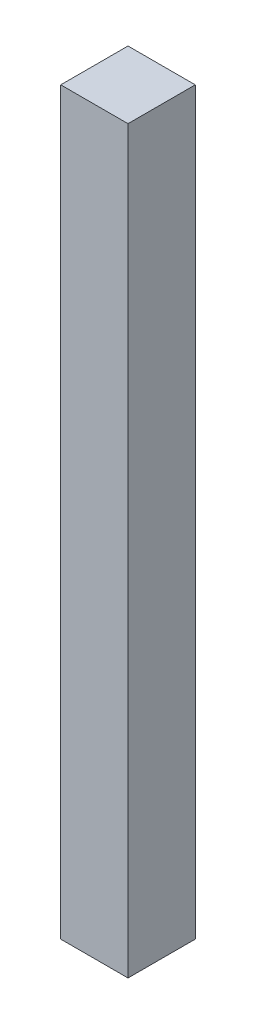
ISO-10303-21;
HEADER;
FILE_DESCRIPTION(('STEP AP214'),'2;1');
FILE_NAME('part.step','',(''),(''),'','','');
FILE_SCHEMA(('AUTOMOTIVE_DESIGN { 1 0 10303 214 1 1 1 1 }'));
ENDSEC;
DATA;
#1=APPLICATION_CONTEXT('core data for automotive mechanical design processes');
#2=APPLICATION_PROTOCOL_DEFINITION('international standard','automotive_design',2000,#1);
#3=PRODUCT_CONTEXT('',#1,'mechanical');
#4=PRODUCT('Part','Part','',(#3));
#5=PRODUCT_RELATED_PRODUCT_CATEGORY('part','',(#4));
#6=PRODUCT_DEFINITION_FORMATION('','',#4);
#7=PRODUCT_DEFINITION_CONTEXT('part definition',#1,'design');
#8=PRODUCT_DEFINITION('design','',#6,#7);
#9=PRODUCT_DEFINITION_SHAPE('','',#8);
#10=(LENGTH_UNIT() NAMED_UNIT(*) SI_UNIT(.MILLI.,.METRE.));
#11=(NAMED_UNIT(*) PLANE_ANGLE_UNIT() SI_UNIT($,.RADIAN.));
#12=(NAMED_UNIT(*) SI_UNIT($,.STERADIAN.) SOLID_ANGLE_UNIT());
#13=UNCERTAINTY_MEASURE_WITH_UNIT(LENGTH_MEASURE(1.E-05),#10,'distance_accuracy_value','');
#14=(GEOMETRIC_REPRESENTATION_CONTEXT(3) GLOBAL_UNCERTAINTY_ASSIGNED_CONTEXT((#13)) GLOBAL_UNIT_ASSIGNED_CONTEXT((#10,
#11,#12)) REPRESENTATION_CONTEXT('',''));
#15=CARTESIAN_POINT('',(0.,0.,0.));
#16=DIRECTION('',(0.,0.,1.));
#17=DIRECTION('',(1.,0.,0.));
#18=AXIS2_PLACEMENT_3D('',#15,#16,#17);
#19=CARTESIAN_POINT('',(10.,220.,-10.));
#20=DIRECTION('',(-1.,0.,0.));
#21=DIRECTION('',(0.,0.,1.));
#22=AXIS2_PLACEMENT_3D('',#19,#20,#21);
#23=PLANE('',#22);
#24=DIRECTION('',(0.,0.,-1.));
#25=VECTOR('',#24,1.);
#26=CARTESIAN_POINT('',(10.,0.,-10.));
#27=LINE('',#26,#25);
#28=CARTESIAN_POINT('',(10.,0.,10.));
#29=VERTEX_POINT('',#28);
#30=CARTESIAN_POINT('',(10.,0.,-10.));
#31=VERTEX_POINT('',#30);
#32=EDGE_CURVE('E97',#29,#31,#27,.T.);
#33=ORIENTED_EDGE('',*,*,#32,.T.);
#34=DIRECTION('',(0.,-1.,0.));
#35=VECTOR('',#34,1.);
#36=CARTESIAN_POINT('',(10.,220.,-10.));
#37=LINE('',#36,#35);
#38=CARTESIAN_POINT('',(10.,220.,-10.));
#39=VERTEX_POINT('',#38);
#40=EDGE_CURVE('E11',#39,#31,#37,.T.);
#41=ORIENTED_EDGE('',*,*,#40,.F.);
#42=DIRECTION('',(0.,0.,-1.));
#43=VECTOR('',#42,1.);
#44=CARTESIAN_POINT('',(10.,220.,-10.));
#45=LINE('',#44,#43);
#46=CARTESIAN_POINT('',(10.,220.,10.));
#47=VERTEX_POINT('',#46);
#48=EDGE_CURVE('E85',#47,#39,#45,.T.);
#49=ORIENTED_EDGE('',*,*,#48,.F.);
#50=DIRECTION('',(0.,-1.,0.));
#51=VECTOR('',#50,1.);
#52=CARTESIAN_POINT('',(10.,220.,10.));
#53=LINE('',#52,#51);
#54=EDGE_CURVE('E93',#47,#29,#53,.T.);
#55=ORIENTED_EDGE('',*,*,#54,.T.);
#56=EDGE_LOOP('',(#33,#41,#49,#55));
#57=FACE_BOUND('',#56,.T.);
#58=ADVANCED_FACE('F34',(#57),#23,.F.);
#59=CARTESIAN_POINT('',(-10.,220.,-10.));
#60=DIRECTION('',(0.,0.,1.));
#61=DIRECTION('',(1.,0.,0.));
#62=AXIS2_PLACEMENT_3D('',#59,#60,#61);
#63=PLANE('',#62);
#64=DIRECTION('',(-1.,0.,0.));
#65=VECTOR('',#64,1.);
#66=CARTESIAN_POINT('',(-10.,0.,-10.));
#67=LINE('',#66,#65);
#68=CARTESIAN_POINT('',(-10.,0.,-10.));
#69=VERTEX_POINT('',#68);
#70=EDGE_CURVE('E89',#31,#69,#67,.T.);
#71=ORIENTED_EDGE('',*,*,#70,.T.);
#72=DIRECTION('',(0.,-1.,0.));
#73=VECTOR('',#72,1.);
#74=CARTESIAN_POINT('',(-10.,220.,-10.));
#75=LINE('',#74,#73);
#76=CARTESIAN_POINT('',(-10.,220.,-10.));
#77=VERTEX_POINT('',#76);
#78=EDGE_CURVE('E42',#77,#69,#75,.T.);
#79=ORIENTED_EDGE('',*,*,#78,.F.);
#80=DIRECTION('',(-1.,0.,0.));
#81=VECTOR('',#80,1.);
#82=CARTESIAN_POINT('',(-10.,220.,-10.));
#83=LINE('',#82,#81);
#84=EDGE_CURVE('E80',#39,#77,#83,.T.);
#85=ORIENTED_EDGE('',*,*,#84,.F.);
#86=ORIENTED_EDGE('',*,*,#40,.T.);
#87=EDGE_LOOP('',(#71,#79,#85,#86));
#88=FACE_BOUND('',#87,.T.);
#89=ADVANCED_FACE('F88',(#88),#63,.F.);
#90=CARTESIAN_POINT('',(-10.,220.,-10.));
#91=DIRECTION('',(1.,0.,0.));
#92=DIRECTION('',(0.,0.,-1.));
#93=AXIS2_PLACEMENT_3D('',#90,#91,#92);
#94=PLANE('',#93);
#95=DIRECTION('',(0.,0.,1.));
#96=VECTOR('',#95,1.);
#97=CARTESIAN_POINT('',(-10.,0.,-10.));
#98=LINE('',#97,#96);
#99=CARTESIAN_POINT('',(-10.,0.,10.));
#100=VERTEX_POINT('',#99);
#101=EDGE_CURVE('E67',#69,#100,#98,.T.);
#102=ORIENTED_EDGE('',*,*,#101,.T.);
#103=DIRECTION('',(0.,-1.,0.));
#104=VECTOR('',#103,1.);
#105=CARTESIAN_POINT('',(-10.,220.,10.));
#106=LINE('',#105,#104);
#107=CARTESIAN_POINT('',(-10.,220.,10.));
#108=VERTEX_POINT('',#107);
#109=EDGE_CURVE('E90',#108,#100,#106,.T.);
#110=ORIENTED_EDGE('',*,*,#109,.F.);
#111=DIRECTION('',(0.,0.,1.));
#112=VECTOR('',#111,1.);
#113=CARTESIAN_POINT('',(-10.,220.,-10.));
#114=LINE('',#113,#112);
#115=EDGE_CURVE('E83',#77,#108,#114,.T.);
#116=ORIENTED_EDGE('',*,*,#115,.F.);
#117=ORIENTED_EDGE('',*,*,#78,.T.);
#118=EDGE_LOOP('',(#102,#110,#116,#117));
#119=FACE_BOUND('',#118,.T.);
#120=ADVANCED_FACE('F91',(#119),#94,.F.);
#121=CARTESIAN_POINT('',(-10.,220.,10.));
#122=DIRECTION('',(0.,0.,-1.));
#123=DIRECTION('',(-1.,0.,0.));
#124=AXIS2_PLACEMENT_3D('',#121,#122,#123);
#125=PLANE('',#124);
#126=DIRECTION('',(1.,0.,0.));
#127=VECTOR('',#126,1.);
#128=CARTESIAN_POINT('',(-10.,0.,10.));
#129=LINE('',#128,#127);
#130=EDGE_CURVE('E73',#100,#29,#129,.T.);
#131=ORIENTED_EDGE('',*,*,#130,.T.);
#132=ORIENTED_EDGE('',*,*,#54,.F.);
#133=DIRECTION('',(1.,0.,0.));
#134=VECTOR('',#133,1.);
#135=CARTESIAN_POINT('',(-10.,220.,10.));
#136=LINE('',#135,#134);
#137=EDGE_CURVE('E50',#108,#47,#136,.T.);
#138=ORIENTED_EDGE('',*,*,#137,.F.);
#139=ORIENTED_EDGE('',*,*,#109,.T.);
#140=EDGE_LOOP('',(#131,#132,#138,#139));
#141=FACE_BOUND('',#140,.T.);
#142=ADVANCED_FACE('F104',(#141),#125,.F.);
#143=CARTESIAN_POINT('',(0.,220.,0.));
#144=DIRECTION('',(0.,1.,0.));
#145=DIRECTION('',(0.,0.,1.));
#146=AXIS2_PLACEMENT_3D('',#143,#144,#145);
#147=PLANE('',#146);
#148=ORIENTED_EDGE('',*,*,#48,.T.);
#149=ORIENTED_EDGE('',*,*,#84,.T.);
#150=ORIENTED_EDGE('',*,*,#115,.T.);
#151=ORIENTED_EDGE('',*,*,#137,.T.);
#152=EDGE_LOOP('',(#148,#149,#150,#151));
#153=FACE_BOUND('',#152,.T.);
#154=ADVANCED_FACE('F81',(#153),#147,.T.);
#155=CARTESIAN_POINT('',(0.,0.,0.));
#156=DIRECTION('',(0.,1.,0.));
#157=DIRECTION('',(0.,0.,1.));
#158=AXIS2_PLACEMENT_3D('',#155,#156,#157);
#159=PLANE('',#158);
#160=ORIENTED_EDGE('',*,*,#32,.F.);
#161=ORIENTED_EDGE('',*,*,#130,.F.);
#162=ORIENTED_EDGE('',*,*,#101,.F.);
#163=ORIENTED_EDGE('',*,*,#70,.F.);
#164=EDGE_LOOP('',(#160,#161,#162,#163));
#165=FACE_BOUND('',#164,.T.);
#166=ADVANCED_FACE('F107',(#165),#159,.F.);
#167=CLOSED_SHELL('',(#58,#89,#120,#142,#154,#166));
#168=MANIFOLD_SOLID_BREP('B2',#167);
#169=ADVANCED_BREP_SHAPE_REPRESENTATION('',(#18,#168),#14);
#170=SHAPE_DEFINITION_REPRESENTATION(#9,#169);
ENDSEC;
END-ISO-10303-21;
